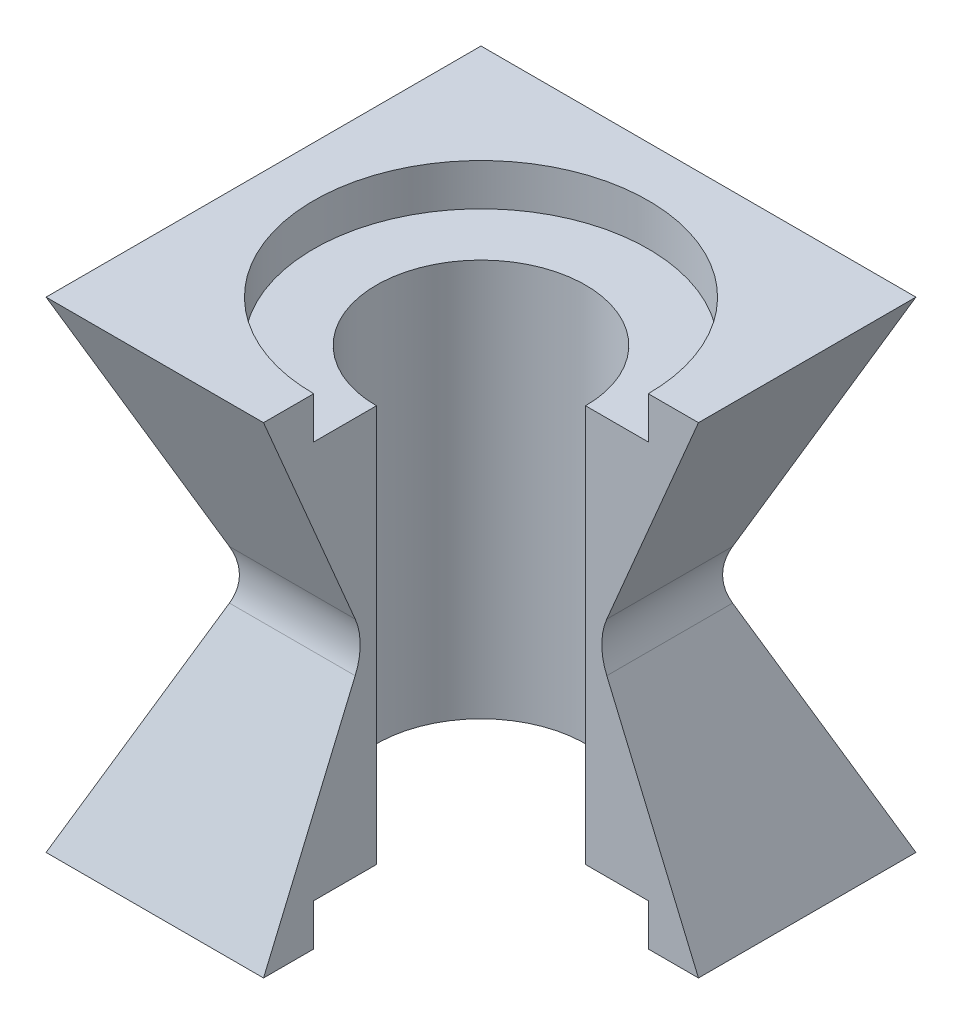
ISO-10303-21;
HEADER;
FILE_DESCRIPTION(('STEP AP214'),'2;1');
FILE_NAME('part.step','',(''),(''),'','','');
FILE_SCHEMA(('AUTOMOTIVE_DESIGN { 1 0 10303 214 1 1 1 1 }'));
ENDSEC;
DATA;
#1=APPLICATION_CONTEXT('core data for automotive mechanical design processes');
#2=APPLICATION_PROTOCOL_DEFINITION('international standard','automotive_design',2000,#1);
#3=PRODUCT_CONTEXT('',#1,'mechanical');
#4=PRODUCT('Part','Part','',(#3));
#5=PRODUCT_RELATED_PRODUCT_CATEGORY('part','',(#4));
#6=PRODUCT_DEFINITION_FORMATION('','',#4);
#7=PRODUCT_DEFINITION_CONTEXT('part definition',#1,'design');
#8=PRODUCT_DEFINITION('design','',#6,#7);
#9=PRODUCT_DEFINITION_SHAPE('','',#8);
#10=(LENGTH_UNIT() NAMED_UNIT(*) SI_UNIT(.MILLI.,.METRE.));
#11=(NAMED_UNIT(*) PLANE_ANGLE_UNIT() SI_UNIT($,.RADIAN.));
#12=(NAMED_UNIT(*) SI_UNIT($,.STERADIAN.) SOLID_ANGLE_UNIT());
#13=UNCERTAINTY_MEASURE_WITH_UNIT(LENGTH_MEASURE(1.E-05),#10,'distance_accuracy_value','');
#14=(GEOMETRIC_REPRESENTATION_CONTEXT(3) GLOBAL_UNCERTAINTY_ASSIGNED_CONTEXT((#13)) GLOBAL_UNIT_ASSIGNED_CONTEXT((#10,
#11,#12)) REPRESENTATION_CONTEXT('',''));
#15=CARTESIAN_POINT('',(0.,0.,0.));
#16=DIRECTION('',(0.,0.,1.));
#17=DIRECTION('',(1.,0.,0.));
#18=AXIS2_PLACEMENT_3D('',#15,#16,#17);
#19=CARTESIAN_POINT('',(52.,0.,104.));
#20=DIRECTION('',(-1.,0.,0.));
#21=DIRECTION('',(0.,0.,1.));
#22=AXIS2_PLACEMENT_3D('',#19,#20,#21);
#23=PLANE('',#22);
#24=DIRECTION('',(0.,1.,0.));
#25=VECTOR('',#24,1.);
#26=CARTESIAN_POINT('',(52.,-364.625368237524,92.));
#27=LINE('',#26,#25);
#28=CARTESIAN_POINT('',(52.,0.,92.));
#29=VERTEX_POINT('',#28);
#30=CARTESIAN_POINT('',(52.,10.,92.));
#31=VERTEX_POINT('',#30);
#32=EDGE_CURVE('E155',#29,#31,#27,.T.);
#33=ORIENTED_EDGE('',*,*,#32,.T.);
#34=DIRECTION('',(0.,0.,1.));
#35=VECTOR('',#34,1.);
#36=CARTESIAN_POINT('',(52.,10.,104.));
#37=LINE('',#36,#35);
#38=CARTESIAN_POINT('',(52.,10.,77.));
#39=VERTEX_POINT('',#38);
#40=EDGE_CURVE('E434',#39,#31,#37,.T.);
#41=ORIENTED_EDGE('',*,*,#40,.F.);
#42=DIRECTION('',(0.,1.,0.));
#43=VECTOR('',#42,1.);
#44=CARTESIAN_POINT('',(52.,0.,77.));
#45=LINE('',#44,#43);
#46=CARTESIAN_POINT('',(52.,105.,77.));
#47=VERTEX_POINT('',#46);
#48=EDGE_CURVE('E194',#47,#39,#45,.F.);
#49=ORIENTED_EDGE('',*,*,#48,.F.);
#50=DIRECTION('',(0.,0.,1.));
#51=VECTOR('',#50,1.);
#52=CARTESIAN_POINT('',(52.,105.,52.));
#53=LINE('',#52,#51);
#54=CARTESIAN_POINT('',(52.,105.,92.));
#55=VERTEX_POINT('',#54);
#56=EDGE_CURVE('E192',#47,#55,#53,.T.);
#57=ORIENTED_EDGE('',*,*,#56,.T.);
#58=DIRECTION('',(0.,1.,0.));
#59=VECTOR('',#58,1.);
#60=CARTESIAN_POINT('',(52.,105.,92.));
#61=LINE('',#60,#59);
#62=CARTESIAN_POINT('',(52.,115.,92.));
#63=VERTEX_POINT('',#62);
#64=EDGE_CURVE('E189',#63,#55,#61,.F.);
#65=ORIENTED_EDGE('',*,*,#64,.F.);
#66=DIRECTION('',(0.,0.,1.));
#67=VECTOR('',#66,1.);
#68=CARTESIAN_POINT('',(52.,115.,104.));
#69=LINE('',#68,#67);
#70=CARTESIAN_POINT('',(52.,115.,104.));
#71=VERTEX_POINT('',#70);
#72=EDGE_CURVE('E163',#63,#71,#69,.T.);
#73=ORIENTED_EDGE('',*,*,#72,.T.);
#74=DIRECTION('',(0.,-0.920504853452443,-0.390731128489268));
#75=VECTOR('',#74,1.);
#76=CARTESIAN_POINT('',(52.,115.,104.));
#77=LINE('',#76,#75);
#78=CARTESIAN_POINT('',(52.,63.360966927339,82.0805309272409));
#79=VERTEX_POINT('',#78);
#80=EDGE_CURVE('E187',#71,#79,#77,.T.);
#81=ORIENTED_EDGE('',*,*,#80,.T.);
#82=CARTESIAN_POINT('',(52.,57.5,95.8881037290275));
#83=DIRECTION('',(-1.,0.,0.));
#84=DIRECTION('',(0.,0.,1.));
#85=AXIS2_PLACEMENT_3D('',#82,#83,#84);
#86=CIRCLE('',#85,15.);
#87=CARTESIAN_POINT('',(52.,51.639033072661,82.0805309272409));
#88=VERTEX_POINT('',#87);
#89=EDGE_CURVE('E52',#88,#79,#86,.F.);
#90=ORIENTED_EDGE('',*,*,#89,.F.);
#91=DIRECTION('',(0.,-0.920504853452443,0.390731128489268));
#92=VECTOR('',#91,1.);
#93=CARTESIAN_POINT('',(52.,57.5,79.5926980679481));
#94=LINE('',#93,#92);
#95=CARTESIAN_POINT('',(52.,0.,104.));
#96=VERTEX_POINT('',#95);
#97=EDGE_CURVE('E176',#88,#96,#94,.T.);
#98=ORIENTED_EDGE('',*,*,#97,.T.);
#99=DIRECTION('',(0.,0.,1.));
#100=VECTOR('',#99,1.);
#101=CARTESIAN_POINT('',(52.,0.,104.));
#102=LINE('',#101,#100);
#103=EDGE_CURVE('E169',#29,#96,#102,.T.);
#104=ORIENTED_EDGE('',*,*,#103,.F.);
#105=EDGE_LOOP('',(#33,#41,#49,#57,#65,#73,#81,#90,#98,#104));
#106=FACE_BOUND('',#105,.T.);
#107=ADVANCED_FACE('F44',(#106),#23,.F.);
#108=CARTESIAN_POINT('',(104.,0.,52.));
#109=DIRECTION('',(0.,0.,-1.));
#110=DIRECTION('',(-1.,0.,0.));
#111=AXIS2_PLACEMENT_3D('',#108,#109,#110);
#112=PLANE('',#111);
#113=DIRECTION('',(0.,1.,0.));
#114=VECTOR('',#113,1.);
#115=CARTESIAN_POINT('',(92.,-364.625368237524,52.));
#116=LINE('',#115,#114);
#117=CARTESIAN_POINT('',(92.,0.,52.));
#118=VERTEX_POINT('',#117);
#119=CARTESIAN_POINT('',(92.,10.,52.));
#120=VERTEX_POINT('',#119);
#121=EDGE_CURVE('E59',#118,#120,#116,.T.);
#122=ORIENTED_EDGE('',*,*,#121,.F.);
#123=DIRECTION('',(-1.,0.,0.));
#124=VECTOR('',#123,1.);
#125=CARTESIAN_POINT('',(104.,0.,52.));
#126=LINE('',#125,#124);
#127=CARTESIAN_POINT('',(104.,0.,52.));
#128=VERTEX_POINT('',#127);
#129=EDGE_CURVE('E172',#128,#118,#126,.T.);
#130=ORIENTED_EDGE('',*,*,#129,.F.);
#131=DIRECTION('',(0.390731128489268,-0.920504853452443,0.));
#132=VECTOR('',#131,1.);
#133=CARTESIAN_POINT('',(79.5926980679482,57.5,52.));
#134=LINE('',#133,#132);
#135=CARTESIAN_POINT('',(82.0805309272409,51.639033072661,52.));
#136=VERTEX_POINT('',#135);
#137=EDGE_CURVE('E67',#136,#128,#134,.T.);
#138=ORIENTED_EDGE('',*,*,#137,.F.);
#139=CARTESIAN_POINT('',(95.8881037290276,57.5,52.));
#140=DIRECTION('',(0.,0.,-1.));
#141=DIRECTION('',(-1.,0.,0.));
#142=AXIS2_PLACEMENT_3D('',#139,#140,#141);
#143=CIRCLE('',#142,15.);
#144=CARTESIAN_POINT('',(82.0805309272409,63.360966927339,52.));
#145=VERTEX_POINT('',#144);
#146=EDGE_CURVE('E12',#145,#136,#143,.F.);
#147=ORIENTED_EDGE('',*,*,#146,.F.);
#148=DIRECTION('',(-0.390731128489268,-0.920504853452443,0.));
#149=VECTOR('',#148,1.);
#150=CARTESIAN_POINT('',(104.,115.,52.));
#151=LINE('',#150,#149);
#152=CARTESIAN_POINT('',(104.,115.,52.));
#153=VERTEX_POINT('',#152);
#154=EDGE_CURVE('E197',#153,#145,#151,.T.);
#155=ORIENTED_EDGE('',*,*,#154,.F.);
#156=DIRECTION('',(-1.,0.,0.));
#157=VECTOR('',#156,1.);
#158=CARTESIAN_POINT('',(104.,115.,52.));
#159=LINE('',#158,#157);
#160=CARTESIAN_POINT('',(92.,115.,52.));
#161=VERTEX_POINT('',#160);
#162=EDGE_CURVE('E178',#153,#161,#159,.T.);
#163=ORIENTED_EDGE('',*,*,#162,.T.);
#164=DIRECTION('',(0.,1.,0.));
#165=VECTOR('',#164,1.);
#166=CARTESIAN_POINT('',(92.,105.,52.));
#167=LINE('',#166,#165);
#168=CARTESIAN_POINT('',(92.,105.,52.));
#169=VERTEX_POINT('',#168);
#170=EDGE_CURVE('E201',#169,#161,#167,.T.);
#171=ORIENTED_EDGE('',*,*,#170,.F.);
#172=DIRECTION('',(-1.,0.,0.));
#173=VECTOR('',#172,1.);
#174=CARTESIAN_POINT('',(52.,105.,52.));
#175=LINE('',#174,#173);
#176=CARTESIAN_POINT('',(77.,105.,52.));
#177=VERTEX_POINT('',#176);
#178=EDGE_CURVE('E204',#169,#177,#175,.T.);
#179=ORIENTED_EDGE('',*,*,#178,.T.);
#180=DIRECTION('',(0.,1.,0.));
#181=VECTOR('',#180,1.);
#182=CARTESIAN_POINT('',(77.,0.,52.));
#183=LINE('',#182,#181);
#184=CARTESIAN_POINT('',(77.,10.,52.));
#185=VERTEX_POINT('',#184);
#186=EDGE_CURVE('E207',#185,#177,#183,.T.);
#187=ORIENTED_EDGE('',*,*,#186,.F.);
#188=DIRECTION('',(-1.,0.,0.));
#189=VECTOR('',#188,1.);
#190=CARTESIAN_POINT('',(104.,10.,52.));
#191=LINE('',#190,#189);
#192=EDGE_CURVE('E173',#120,#185,#191,.T.);
#193=ORIENTED_EDGE('',*,*,#192,.F.);
#194=EDGE_LOOP('',(#122,#130,#138,#147,#155,#163,#171,#179,#187,#193));
#195=FACE_BOUND('',#194,.T.);
#196=ADVANCED_FACE('F340',(#195),#112,.F.);
#197=CARTESIAN_POINT('',(52.,0.,52.));
#198=DIRECTION('',(0.,1.,0.));
#199=DIRECTION('',(0.,0.,1.));
#200=AXIS2_PLACEMENT_3D('',#197,#198,#199);
#201=CYLINDRICAL_SURFACE('',#200,25.);
#202=ORIENTED_EDGE('',*,*,#48,.T.);
#203=CARTESIAN_POINT('',(52.,10.,52.));
#204=DIRECTION('',(0.,1.,0.));
#205=DIRECTION('',(0.,0.,1.));
#206=AXIS2_PLACEMENT_3D('',#203,#204,#205);
#207=CIRCLE('',#206,25.);
#208=EDGE_CURVE('E437',#185,#39,#207,.T.);
#209=ORIENTED_EDGE('',*,*,#208,.F.);
#210=ORIENTED_EDGE('',*,*,#186,.T.);
#211=CARTESIAN_POINT('',(52.,105.,52.));
#212=DIRECTION('',(0.,1.,0.));
#213=DIRECTION('',(0.,0.,1.));
#214=AXIS2_PLACEMENT_3D('',#211,#212,#213);
#215=CIRCLE('',#214,25.);
#216=EDGE_CURVE('E213',#47,#177,#215,.F.);
#217=ORIENTED_EDGE('',*,*,#216,.F.);
#218=EDGE_LOOP('',(#202,#209,#210,#217));
#219=FACE_BOUND('',#218,.T.);
#220=ADVANCED_FACE('F332',(#219),#201,.F.);
#221=CARTESIAN_POINT('',(79.5926980679482,57.5,0.));
#222=DIRECTION('',(-0.920504853452443,-0.390731128489268,0.));
#223=DIRECTION('',(0.390731128489268,-0.920504853452443,0.));
#224=AXIS2_PLACEMENT_3D('',#221,#222,#223);
#225=PLANE('',#224);
#226=DIRECTION('',(0.,0.,1.));
#227=VECTOR('',#226,1.);
#228=CARTESIAN_POINT('',(82.0805309272409,51.639033072661,79.5926980679482));
#229=LINE('',#228,#227);
#230=CARTESIAN_POINT('',(82.0805309272409,51.639033072661,21.9194690727591));
#231=VERTEX_POINT('',#230);
#232=EDGE_CURVE('E269',#231,#136,#229,.T.);
#233=ORIENTED_EDGE('',*,*,#232,.T.);
#234=ORIENTED_EDGE('',*,*,#137,.T.);
#235=DIRECTION('',(0.,0.,-1.));
#236=VECTOR('',#235,1.);
#237=CARTESIAN_POINT('',(104.,0.,104.));
#238=LINE('',#237,#236);
#239=CARTESIAN_POINT('',(104.,0.,0.));
#240=VERTEX_POINT('',#239);
#241=EDGE_CURVE('E239',#128,#240,#238,.T.);
#242=ORIENTED_EDGE('',*,*,#241,.T.);
#243=DIRECTION('',(0.363936289648098,-0.857380168976605,-0.363936289648098));
#244=VECTOR('',#243,1.);
#245=CARTESIAN_POINT('',(82.8254360054119,49.8841466819376,21.174563994588));
#246=LINE('',#245,#244);
#247=EDGE_CURVE('E218',#231,#240,#246,.T.);
#248=ORIENTED_EDGE('',*,*,#247,.F.);
#249=EDGE_LOOP('',(#233,#234,#242,#248));
#250=FACE_BOUND('',#249,.T.);
#251=ADVANCED_FACE('F330',(#250),#225,.F.);
#252=CARTESIAN_POINT('',(104.,115.,0.));
#253=DIRECTION('',(-0.920504853452443,0.390731128489268,0.));
#254=DIRECTION('',(-0.390731128489268,-0.920504853452443,0.));
#255=AXIS2_PLACEMENT_3D('',#252,#253,#254);
#256=PLANE('',#255);
#257=DIRECTION('',(0.,0.,-1.));
#258=VECTOR('',#257,1.);
#259=CARTESIAN_POINT('',(104.,115.,104.));
#260=LINE('',#259,#258);
#261=CARTESIAN_POINT('',(104.,115.,0.));
#262=VERTEX_POINT('',#261);
#263=EDGE_CURVE('E237',#153,#262,#260,.T.);
#264=ORIENTED_EDGE('',*,*,#263,.F.);
#265=ORIENTED_EDGE('',*,*,#154,.T.);
#266=DIRECTION('',(0.,0.,1.));
#267=VECTOR('',#266,1.);
#268=CARTESIAN_POINT('',(82.0805309272409,63.360966927339,24.4073019320518));
#269=LINE('',#268,#267);
#270=CARTESIAN_POINT('',(82.0805309272409,63.360966927339,21.9194690727591));
#271=VERTEX_POINT('',#270);
#272=EDGE_CURVE('E272',#145,#271,#269,.F.);
#273=ORIENTED_EDGE('',*,*,#272,.T.);
#274=DIRECTION('',(-0.363936289648098,-0.857380168976605,0.363936289648098));
#275=VECTOR('',#274,1.);
#276=CARTESIAN_POINT('',(104.,115.,0.));
#277=LINE('',#276,#275);
#278=EDGE_CURVE('E221',#262,#271,#277,.T.);
#279=ORIENTED_EDGE('',*,*,#278,.F.);
#280=EDGE_LOOP('',(#264,#265,#273,#279));
#281=FACE_BOUND('',#280,.T.);
#282=ADVANCED_FACE('F307',(#281),#256,.F.);
#283=CARTESIAN_POINT('',(0.,115.,0.));
#284=DIRECTION('',(0.920504853452443,0.390731128489268,0.));
#285=DIRECTION('',(-0.390731128489268,0.920504853452443,0.));
#286=AXIS2_PLACEMENT_3D('',#283,#284,#285);
#287=PLANE('',#286);
#288=DIRECTION('',(-0.363936289648098,0.857380168976605,-0.363936289648098));
#289=VECTOR('',#288,1.);
#290=CARTESIAN_POINT('',(0.,115.,0.));
#291=LINE('',#290,#289);
#292=CARTESIAN_POINT('',(21.9194690727591,63.360966927339,21.9194690727591));
#293=VERTEX_POINT('',#292);
#294=CARTESIAN_POINT('',(0.,115.,0.));
#295=VERTEX_POINT('',#294);
#296=EDGE_CURVE('E249',#293,#295,#291,.T.);
#297=ORIENTED_EDGE('',*,*,#296,.F.);
#298=DIRECTION('',(0.,0.,1.));
#299=VECTOR('',#298,1.);
#300=CARTESIAN_POINT('',(21.9194690727591,63.360966927339,79.5926980679481));
#301=LINE('',#300,#299);
#302=CARTESIAN_POINT('',(21.9194690727591,63.360966927339,82.0805309272409));
#303=VERTEX_POINT('',#302);
#304=EDGE_CURVE('E261',#293,#303,#301,.T.);
#305=ORIENTED_EDGE('',*,*,#304,.T.);
#306=DIRECTION('',(0.363936289648098,-0.857380168976605,-0.363936289648098));
#307=VECTOR('',#306,1.);
#308=CARTESIAN_POINT('',(13.7747607839737,82.5486972184187,90.2252392160263));
#309=LINE('',#308,#307);
#310=CARTESIAN_POINT('',(0.,115.,104.));
#311=VERTEX_POINT('',#310);
#312=EDGE_CURVE('E251',#311,#303,#309,.T.);
#313=ORIENTED_EDGE('',*,*,#312,.F.);
#314=DIRECTION('',(0.,0.,-1.));
#315=VECTOR('',#314,1.);
#316=CARTESIAN_POINT('',(0.,115.,104.));
#317=LINE('',#316,#315);
#318=EDGE_CURVE('E230',#311,#295,#317,.T.);
#319=ORIENTED_EDGE('',*,*,#318,.T.);
#320=EDGE_LOOP('',(#297,#305,#313,#319));
#321=FACE_BOUND('',#320,.T.);
#322=ADVANCED_FACE('F294',(#321),#287,.F.);
#323=CARTESIAN_POINT('',(24.4073019320518,57.5,0.));
#324=DIRECTION('',(0.920504853452443,-0.390731128489268,0.));
#325=DIRECTION('',(0.390731128489268,0.920504853452443,0.));
#326=AXIS2_PLACEMENT_3D('',#323,#324,#325);
#327=PLANE('',#326);
#328=DIRECTION('',(-0.363936289648098,-0.857380168976605,0.363936289648098));
#329=VECTOR('',#328,1.);
#330=CARTESIAN_POINT('',(34.9493247785618,82.3354494635189,69.0506752214382));
#331=LINE('',#330,#329);
#332=CARTESIAN_POINT('',(21.9194690727591,51.639033072661,82.0805309272409));
#333=VERTEX_POINT('',#332);
#334=CARTESIAN_POINT('',(0.,0.,104.));
#335=VERTEX_POINT('',#334);
#336=EDGE_CURVE('E247',#333,#335,#331,.T.);
#337=ORIENTED_EDGE('',*,*,#336,.F.);
#338=DIRECTION('',(0.,0.,1.));
#339=VECTOR('',#338,1.);
#340=CARTESIAN_POINT('',(21.9194690727591,51.639033072661,24.4073019320518));
#341=LINE('',#340,#339);
#342=CARTESIAN_POINT('',(21.9194690727591,51.639033072661,21.9194690727591));
#343=VERTEX_POINT('',#342);
#344=EDGE_CURVE('E263',#333,#343,#341,.F.);
#345=ORIENTED_EDGE('',*,*,#344,.T.);
#346=DIRECTION('',(0.363936289648098,0.857380168976605,0.363936289648098));
#347=VECTOR('',#346,1.);
#348=CARTESIAN_POINT('',(21.1745639945881,49.8841466819376,21.174563994588));
#349=LINE('',#348,#347);
#350=CARTESIAN_POINT('',(0.,0.,0.));
#351=VERTEX_POINT('',#350);
#352=EDGE_CURVE('E244',#351,#343,#349,.T.);
#353=ORIENTED_EDGE('',*,*,#352,.F.);
#354=DIRECTION('',(0.,0.,-1.));
#355=VECTOR('',#354,1.);
#356=CARTESIAN_POINT('',(0.,0.,104.));
#357=LINE('',#356,#355);
#358=EDGE_CURVE('E241',#335,#351,#357,.T.);
#359=ORIENTED_EDGE('',*,*,#358,.F.);
#360=EDGE_LOOP('',(#337,#345,#353,#359));
#361=FACE_BOUND('',#360,.T.);
#362=ADVANCED_FACE('F323',(#361),#327,.F.);
#363=CARTESIAN_POINT('',(0.,0.,104.));
#364=DIRECTION('',(0.,1.,0.));
#365=DIRECTION('',(0.,0.,1.));
#366=AXIS2_PLACEMENT_3D('',#363,#364,#365);
#367=PLANE('',#366);
#368=CARTESIAN_POINT('',(52.,0.,52.));
#369=DIRECTION('',(0.,1.,0.));
#370=DIRECTION('',(0.,0.,1.));
#371=AXIS2_PLACEMENT_3D('',#368,#369,#370);
#372=CIRCLE('',#371,40.);
#373=EDGE_CURVE('E158',#118,#29,#372,.T.);
#374=ORIENTED_EDGE('',*,*,#373,.T.);
#375=ORIENTED_EDGE('',*,*,#103,.T.);
#376=DIRECTION('',(1.,0.,0.));
#377=VECTOR('',#376,1.);
#378=CARTESIAN_POINT('',(0.,0.,104.));
#379=LINE('',#378,#377);
#380=EDGE_CURVE('E225',#335,#96,#379,.T.);
#381=ORIENTED_EDGE('',*,*,#380,.F.);
#382=ORIENTED_EDGE('',*,*,#358,.T.);
#383=DIRECTION('',(1.,0.,0.));
#384=VECTOR('',#383,1.);
#385=CARTESIAN_POINT('',(0.,0.,0.));
#386=LINE('',#385,#384);
#387=EDGE_CURVE('E224',#351,#240,#386,.T.);
#388=ORIENTED_EDGE('',*,*,#387,.T.);
#389=ORIENTED_EDGE('',*,*,#241,.F.);
#390=ORIENTED_EDGE('',*,*,#129,.T.);
#391=EDGE_LOOP('',(#374,#375,#381,#382,#388,#389,#390));
#392=FACE_BOUND('',#391,.T.);
#393=ADVANCED_FACE('F167',(#392),#367,.F.);
#394=CARTESIAN_POINT('',(0.,115.,104.));
#395=DIRECTION('',(0.,-1.,0.));
#396=DIRECTION('',(0.,0.,-1.));
#397=AXIS2_PLACEMENT_3D('',#394,#395,#396);
#398=PLANE('',#397);
#399=DIRECTION('',(-1.,0.,0.));
#400=VECTOR('',#399,1.);
#401=CARTESIAN_POINT('',(0.,115.,104.));
#402=LINE('',#401,#400);
#403=EDGE_CURVE('E227',#71,#311,#402,.T.);
#404=ORIENTED_EDGE('',*,*,#403,.F.);
#405=ORIENTED_EDGE('',*,*,#72,.F.);
#406=CARTESIAN_POINT('',(52.,115.,52.));
#407=DIRECTION('',(0.,1.,0.));
#408=DIRECTION('',(0.,0.,1.));
#409=AXIS2_PLACEMENT_3D('',#406,#407,#408);
#410=CIRCLE('',#409,40.);
#411=EDGE_CURVE('E214',#161,#63,#410,.T.);
#412=ORIENTED_EDGE('',*,*,#411,.F.);
#413=ORIENTED_EDGE('',*,*,#162,.F.);
#414=ORIENTED_EDGE('',*,*,#263,.T.);
#415=DIRECTION('',(-1.,0.,0.));
#416=VECTOR('',#415,1.);
#417=CARTESIAN_POINT('',(0.,115.,0.));
#418=LINE('',#417,#416);
#419=EDGE_CURVE('E228',#262,#295,#418,.T.);
#420=ORIENTED_EDGE('',*,*,#419,.T.);
#421=ORIENTED_EDGE('',*,*,#318,.F.);
#422=EDGE_LOOP('',(#404,#405,#412,#413,#414,#420,#421));
#423=FACE_BOUND('',#422,.T.);
#424=ADVANCED_FACE('F297',(#423),#398,.F.);
#425=CARTESIAN_POINT('',(104.,115.,0.));
#426=DIRECTION('',(0.,-0.390731128489268,-0.920504853452443));
#427=DIRECTION('',(0.,0.920504853452443,-0.390731128489268));
#428=AXIS2_PLACEMENT_3D('',#425,#426,#427);
#429=PLANE('',#428);
#430=ORIENTED_EDGE('',*,*,#278,.T.);
#431=DIRECTION('',(-1.,0.,0.));
#432=VECTOR('',#431,1.);
#433=CARTESIAN_POINT('',(24.4073019320519,63.360966927339,21.9194690727591));
#434=LINE('',#433,#432);
#435=EDGE_CURVE('E265',#271,#293,#434,.T.);
#436=ORIENTED_EDGE('',*,*,#435,.T.);
#437=ORIENTED_EDGE('',*,*,#296,.T.);
#438=ORIENTED_EDGE('',*,*,#419,.F.);
#439=EDGE_LOOP('',(#430,#436,#437,#438));
#440=FACE_BOUND('',#439,.T.);
#441=ADVANCED_FACE('F304',(#440),#429,.T.);
#442=CARTESIAN_POINT('',(104.,57.5,24.4073019320518));
#443=DIRECTION('',(0.,0.390731128489268,-0.920504853452443));
#444=DIRECTION('',(0.,0.920504853452443,0.390731128489268));
#445=AXIS2_PLACEMENT_3D('',#442,#443,#444);
#446=PLANE('',#445);
#447=ORIENTED_EDGE('',*,*,#352,.T.);
#448=DIRECTION('',(-1.,0.,0.));
#449=VECTOR('',#448,1.);
#450=CARTESIAN_POINT('',(79.5926980679482,51.639033072661,21.9194690727591));
#451=LINE('',#450,#449);
#452=EDGE_CURVE('E267',#343,#231,#451,.F.);
#453=ORIENTED_EDGE('',*,*,#452,.T.);
#454=ORIENTED_EDGE('',*,*,#247,.T.);
#455=ORIENTED_EDGE('',*,*,#387,.F.);
#456=EDGE_LOOP('',(#447,#453,#454,#455));
#457=FACE_BOUND('',#456,.T.);
#458=ADVANCED_FACE('F327',(#457),#446,.T.);
#459=CARTESIAN_POINT('',(104.,115.,104.));
#460=DIRECTION('',(0.,-0.390731128489268,0.920504853452443));
#461=DIRECTION('',(0.,-0.920504853452443,-0.390731128489268));
#462=AXIS2_PLACEMENT_3D('',#459,#460,#461);
#463=PLANE('',#462);
#464=ORIENTED_EDGE('',*,*,#80,.F.);
#465=ORIENTED_EDGE('',*,*,#403,.T.);
#466=ORIENTED_EDGE('',*,*,#312,.T.);
#467=DIRECTION('',(-1.,0.,0.));
#468=VECTOR('',#467,1.);
#469=CARTESIAN_POINT('',(79.5926980679482,63.360966927339,82.0805309272409));
#470=LINE('',#469,#468);
#471=EDGE_CURVE('E258',#303,#79,#470,.F.);
#472=ORIENTED_EDGE('',*,*,#471,.T.);
#473=EDGE_LOOP('',(#464,#465,#466,#472));
#474=FACE_BOUND('',#473,.T.);
#475=ADVANCED_FACE('F288',(#474),#463,.T.);
#476=CARTESIAN_POINT('',(104.,57.5,79.5926980679481));
#477=DIRECTION('',(0.,0.390731128489268,0.920504853452443));
#478=DIRECTION('',(0.,-0.920504853452443,0.390731128489268));
#479=AXIS2_PLACEMENT_3D('',#476,#477,#478);
#480=PLANE('',#479);
#481=ORIENTED_EDGE('',*,*,#97,.F.);
#482=DIRECTION('',(-1.,0.,0.));
#483=VECTOR('',#482,1.);
#484=CARTESIAN_POINT('',(24.4073019320519,51.639033072661,82.0805309272409));
#485=LINE('',#484,#483);
#486=EDGE_CURVE('E254',#88,#333,#485,.T.);
#487=ORIENTED_EDGE('',*,*,#486,.T.);
#488=ORIENTED_EDGE('',*,*,#336,.T.);
#489=ORIENTED_EDGE('',*,*,#380,.T.);
#490=EDGE_LOOP('',(#481,#487,#488,#489));
#491=FACE_BOUND('',#490,.T.);
#492=ADVANCED_FACE('F325',(#491),#480,.T.);
#493=CARTESIAN_POINT('',(52.,105.,52.));
#494=DIRECTION('',(0.,1.,0.));
#495=DIRECTION('',(0.,0.,1.));
#496=AXIS2_PLACEMENT_3D('',#493,#494,#495);
#497=PLANE('',#496);
#498=ORIENTED_EDGE('',*,*,#56,.F.);
#499=ORIENTED_EDGE('',*,*,#216,.T.);
#500=ORIENTED_EDGE('',*,*,#178,.F.);
#501=CARTESIAN_POINT('',(52.,105.,52.));
#502=DIRECTION('',(0.,1.,0.));
#503=DIRECTION('',(0.,0.,1.));
#504=AXIS2_PLACEMENT_3D('',#501,#502,#503);
#505=CIRCLE('',#504,40.);
#506=EDGE_CURVE('E210',#169,#55,#505,.T.);
#507=ORIENTED_EDGE('',*,*,#506,.T.);
#508=EDGE_LOOP('',(#498,#499,#500,#507));
#509=FACE_BOUND('',#508,.T.);
#510=ADVANCED_FACE('F353',(#509),#497,.T.);
#511=CARTESIAN_POINT('',(52.,105.,52.));
#512=DIRECTION('',(0.,1.,0.));
#513=DIRECTION('',(0.,0.,1.));
#514=AXIS2_PLACEMENT_3D('',#511,#512,#513);
#515=CYLINDRICAL_SURFACE('',#514,40.);
#516=ORIENTED_EDGE('',*,*,#411,.T.);
#517=ORIENTED_EDGE('',*,*,#64,.T.);
#518=ORIENTED_EDGE('',*,*,#506,.F.);
#519=ORIENTED_EDGE('',*,*,#170,.T.);
#520=EDGE_LOOP('',(#516,#517,#518,#519));
#521=FACE_BOUND('',#520,.T.);
#522=ADVANCED_FACE('F356',(#521),#515,.F.);
#523=CARTESIAN_POINT('',(104.,57.5,8.11189627097243));
#524=DIRECTION('',(1.,0.,0.));
#525=DIRECTION('',(0.,0.,-1.));
#526=AXIS2_PLACEMENT_3D('',#523,#524,#525);
#527=CYLINDRICAL_SURFACE('',#526,15.);
#528=CARTESIAN_POINT('',(8.11189627097245,57.5,8.11189627097243));
#529=DIRECTION('',(0.707106781186547,0.,-0.707106781186547));
#530=DIRECTION('',(0.707106781186547,0.,0.707106781186547));
#531=AXIS2_PLACEMENT_3D('',#528,#529,#530);
#532=ELLIPSE('',#531,21.2132034355964,15.);
#533=EDGE_CURVE('E276',#293,#343,#532,.T.);
#534=ORIENTED_EDGE('',*,*,#533,.F.);
#535=ORIENTED_EDGE('',*,*,#435,.F.);
#536=CARTESIAN_POINT('',(95.8881037290276,57.5,8.11189627097243));
#537=DIRECTION('',(-0.707106781186547,0.,-0.707106781186547));
#538=DIRECTION('',(0.707106781186547,0.,-0.707106781186547));
#539=AXIS2_PLACEMENT_3D('',#536,#537,#538);
#540=ELLIPSE('',#539,21.2132034355964,15.);
#541=EDGE_CURVE('E217',#231,#271,#540,.T.);
#542=ORIENTED_EDGE('',*,*,#541,.F.);
#543=ORIENTED_EDGE('',*,*,#452,.F.);
#544=EDGE_LOOP('',(#534,#535,#542,#543));
#545=FACE_BOUND('',#544,.T.);
#546=ADVANCED_FACE('F46',(#545),#527,.F.);
#547=CARTESIAN_POINT('',(95.8881037290276,57.5,0.));
#548=DIRECTION('',(0.,0.,-1.));
#549=DIRECTION('',(-1.,0.,0.));
#550=AXIS2_PLACEMENT_3D('',#547,#548,#549);
#551=CYLINDRICAL_SURFACE('',#550,15.);
#552=ORIENTED_EDGE('',*,*,#272,.F.);
#553=ORIENTED_EDGE('',*,*,#146,.T.);
#554=ORIENTED_EDGE('',*,*,#232,.F.);
#555=ORIENTED_EDGE('',*,*,#541,.T.);
#556=EDGE_LOOP('',(#552,#553,#554,#555));
#557=FACE_BOUND('',#556,.T.);
#558=ADVANCED_FACE('F310',(#557),#551,.F.);
#559=CARTESIAN_POINT('',(8.11189627097245,57.5,0.));
#560=DIRECTION('',(0.,0.,-1.));
#561=DIRECTION('',(-1.,0.,0.));
#562=AXIS2_PLACEMENT_3D('',#559,#560,#561);
#563=CYLINDRICAL_SURFACE('',#562,15.);
#564=ORIENTED_EDGE('',*,*,#533,.T.);
#565=ORIENTED_EDGE('',*,*,#344,.F.);
#566=CARTESIAN_POINT('',(8.11189627097245,57.5,95.8881037290275));
#567=DIRECTION('',(-0.707106781186547,0.,-0.707106781186547));
#568=DIRECTION('',(0.707106781186547,0.,-0.707106781186547));
#569=AXIS2_PLACEMENT_3D('',#566,#567,#568);
#570=ELLIPSE('',#569,21.2132034355964,15.);
#571=EDGE_CURVE('E209',#303,#333,#570,.T.);
#572=ORIENTED_EDGE('',*,*,#571,.F.);
#573=ORIENTED_EDGE('',*,*,#304,.F.);
#574=EDGE_LOOP('',(#564,#565,#572,#573));
#575=FACE_BOUND('',#574,.T.);
#576=ADVANCED_FACE('F318',(#575),#563,.F.);
#577=CARTESIAN_POINT('',(104.,57.5,95.8881037290275));
#578=DIRECTION('',(1.,0.,0.));
#579=DIRECTION('',(0.,0.,-1.));
#580=AXIS2_PLACEMENT_3D('',#577,#578,#579);
#581=CYLINDRICAL_SURFACE('',#580,15.);
#582=ORIENTED_EDGE('',*,*,#486,.F.);
#583=ORIENTED_EDGE('',*,*,#89,.T.);
#584=ORIENTED_EDGE('',*,*,#471,.F.);
#585=ORIENTED_EDGE('',*,*,#571,.T.);
#586=EDGE_LOOP('',(#582,#583,#584,#585));
#587=FACE_BOUND('',#586,.T.);
#588=ADVANCED_FACE('F284',(#587),#581,.F.);
#589=CARTESIAN_POINT('',(52.,-364.625368237524,52.));
#590=DIRECTION('',(0.,1.,0.));
#591=DIRECTION('',(0.,0.,1.));
#592=AXIS2_PLACEMENT_3D('',#589,#590,#591);
#593=CYLINDRICAL_SURFACE('',#592,40.);
#594=ORIENTED_EDGE('',*,*,#373,.F.);
#595=ORIENTED_EDGE('',*,*,#121,.T.);
#596=CARTESIAN_POINT('',(52.,10.,52.));
#597=DIRECTION('',(0.,1.,0.));
#598=DIRECTION('',(0.,0.,1.));
#599=AXIS2_PLACEMENT_3D('',#596,#597,#598);
#600=CIRCLE('',#599,40.);
#601=EDGE_CURVE('E159',#120,#31,#600,.T.);
#602=ORIENTED_EDGE('',*,*,#601,.T.);
#603=ORIENTED_EDGE('',*,*,#32,.F.);
#604=EDGE_LOOP('',(#594,#595,#602,#603));
#605=FACE_BOUND('',#604,.T.);
#606=ADVANCED_FACE('F157',(#605),#593,.F.);
#607=CARTESIAN_POINT('',(0.,10.,104.));
#608=DIRECTION('',(0.,1.,0.));
#609=DIRECTION('',(0.,0.,1.));
#610=AXIS2_PLACEMENT_3D('',#607,#608,#609);
#611=PLANE('',#610);
#612=ORIENTED_EDGE('',*,*,#40,.T.);
#613=ORIENTED_EDGE('',*,*,#601,.F.);
#614=ORIENTED_EDGE('',*,*,#192,.T.);
#615=ORIENTED_EDGE('',*,*,#208,.T.);
#616=EDGE_LOOP('',(#612,#613,#614,#615));
#617=FACE_BOUND('',#616,.T.);
#618=ADVANCED_FACE('F423',(#617),#611,.F.);
#619=CLOSED_SHELL('',(#107,#196,#220,#251,#282,#322,#362,#393,#424,#441,#458,#475,#492,#510,
#522,#546,#558,#576,#588,#606,#618));
#620=MANIFOLD_SOLID_BREP('B2',#619);
#621=ADVANCED_BREP_SHAPE_REPRESENTATION('',(#18,#620),#14);
#622=SHAPE_DEFINITION_REPRESENTATION(#9,#621);
ENDSEC;
END-ISO-10303-21;
